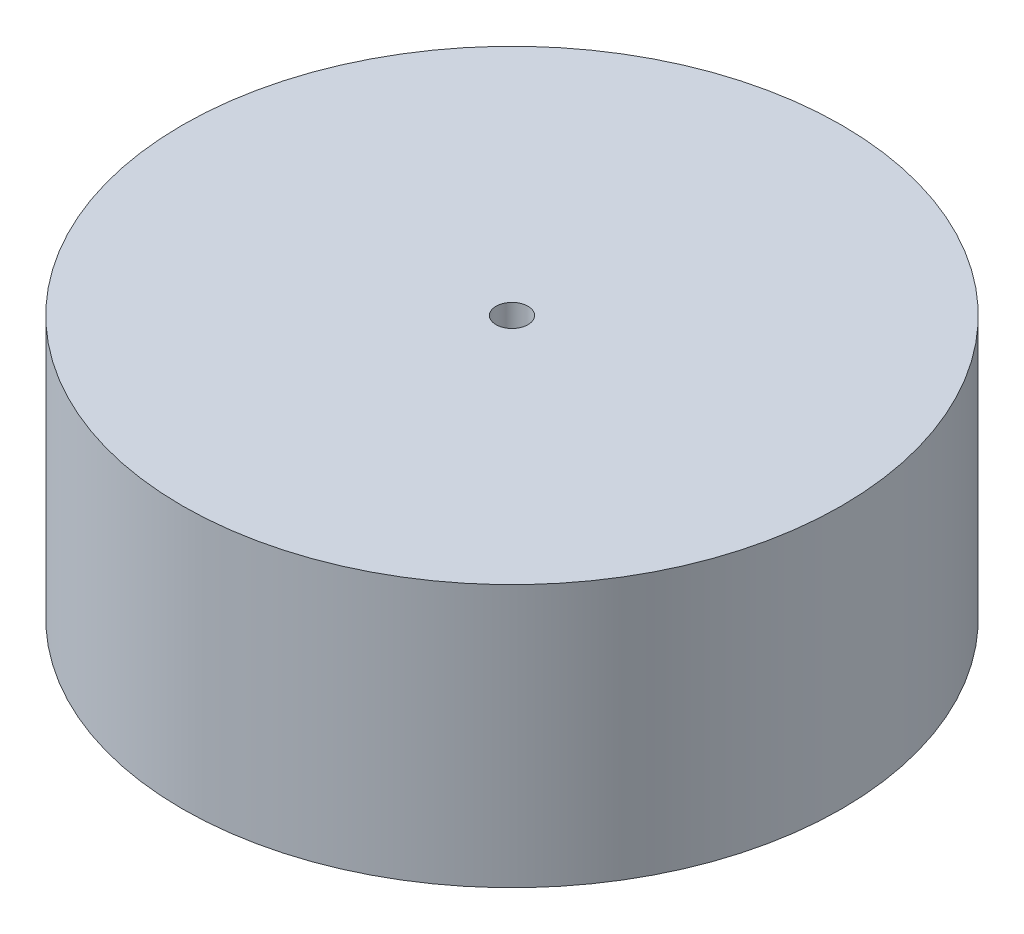
ISO-10303-21;
HEADER;
FILE_DESCRIPTION(('STEP AP214'),'2;1');
FILE_NAME('part.step','',(''),(''),'','','');
FILE_SCHEMA(('AUTOMOTIVE_DESIGN { 1 0 10303 214 1 1 1 1 }'));
ENDSEC;
DATA;
#1=APPLICATION_CONTEXT('core data for automotive mechanical design processes');
#2=APPLICATION_PROTOCOL_DEFINITION('international standard','automotive_design',2000,#1);
#3=PRODUCT_CONTEXT('',#1,'mechanical');
#4=PRODUCT('Part','Part','',(#3));
#5=PRODUCT_RELATED_PRODUCT_CATEGORY('part','',(#4));
#6=PRODUCT_DEFINITION_FORMATION('','',#4);
#7=PRODUCT_DEFINITION_CONTEXT('part definition',#1,'design');
#8=PRODUCT_DEFINITION('design','',#6,#7);
#9=PRODUCT_DEFINITION_SHAPE('','',#8);
#10=(LENGTH_UNIT() NAMED_UNIT(*) SI_UNIT(.MILLI.,.METRE.));
#11=(NAMED_UNIT(*) PLANE_ANGLE_UNIT() SI_UNIT($,.RADIAN.));
#12=(NAMED_UNIT(*) SI_UNIT($,.STERADIAN.) SOLID_ANGLE_UNIT());
#13=UNCERTAINTY_MEASURE_WITH_UNIT(LENGTH_MEASURE(1.E-05),#10,'distance_accuracy_value','');
#14=(GEOMETRIC_REPRESENTATION_CONTEXT(3) GLOBAL_UNCERTAINTY_ASSIGNED_CONTEXT((#13)) GLOBAL_UNIT_ASSIGNED_CONTEXT((#10,
#11,#12)) REPRESENTATION_CONTEXT('',''));
#15=CARTESIAN_POINT('',(0.,0.,0.));
#16=DIRECTION('',(0.,0.,1.));
#17=DIRECTION('',(1.,0.,0.));
#18=AXIS2_PLACEMENT_3D('',#15,#16,#17);
#19=CARTESIAN_POINT('',(0.,41.,0.));
#20=DIRECTION('',(0.,-1.,0.));
#21=DIRECTION('',(0.,0.,-1.));
#22=AXIS2_PLACEMENT_3D('',#19,#20,#21);
#23=CYLINDRICAL_SURFACE('',#22,51.5);
#24=CARTESIAN_POINT('',(0.,41.,0.));
#25=DIRECTION('',(0.,1.,0.));
#26=DIRECTION('',(0.,0.,1.));
#27=AXIS2_PLACEMENT_3D('',#24,#25,#26);
#28=CIRCLE('',#27,51.5);
#29=CARTESIAN_POINT('',(0.,41.,51.5));
#30=VERTEX_POINT('',#29);
#31=EDGE_CURVE('E10',#30,#30,#28,.T.);
#32=ORIENTED_EDGE('',*,*,#31,.F.);
#33=EDGE_LOOP('',(#32));
#34=FACE_BOUND('',#33,.T.);
#35=CARTESIAN_POINT('',(0.,0.,0.));
#36=DIRECTION('',(0.,1.,0.));
#37=DIRECTION('',(0.,0.,1.));
#38=AXIS2_PLACEMENT_3D('',#35,#36,#37);
#39=CIRCLE('',#38,51.5);
#40=CARTESIAN_POINT('',(0.,0.,51.5));
#41=VERTEX_POINT('',#40);
#42=EDGE_CURVE('E45',#41,#41,#39,.T.);
#43=ORIENTED_EDGE('',*,*,#42,.T.);
#44=EDGE_LOOP('',(#43));
#45=FACE_BOUND('',#44,.T.);
#46=ADVANCED_FACE('F39',(#34,#45),#23,.T.);
#47=CARTESIAN_POINT('',(0.,41.,0.));
#48=DIRECTION('',(0.,1.,0.));
#49=DIRECTION('',(0.,0.,1.));
#50=AXIS2_PLACEMENT_3D('',#47,#48,#49);
#51=PLANE('',#50);
#52=CARTESIAN_POINT('',(0.,41.,0.));
#53=DIRECTION('',(0.,1.,0.));
#54=DIRECTION('',(0.,0.,1.));
#55=AXIS2_PLACEMENT_3D('',#52,#53,#54);
#56=CIRCLE('',#55,2.5);
#57=CARTESIAN_POINT('',(0.,41.,2.5));
#58=VERTEX_POINT('',#57);
#59=EDGE_CURVE('E51',#58,#58,#56,.T.);
#60=ORIENTED_EDGE('',*,*,#59,.F.);
#61=EDGE_LOOP('',(#60));
#62=FACE_BOUND('',#61,.T.);
#63=ORIENTED_EDGE('',*,*,#31,.T.);
#64=EDGE_LOOP('',(#63));
#65=FACE_BOUND('',#64,.T.);
#66=ADVANCED_FACE('F68',(#62,#65),#51,.T.);
#67=CARTESIAN_POINT('',(0.,0.,0.));
#68=DIRECTION('',(0.,1.,0.));
#69=DIRECTION('',(0.,0.,1.));
#70=AXIS2_PLACEMENT_3D('',#67,#68,#69);
#71=PLANE('',#70);
#72=CARTESIAN_POINT('',(0.,0.,0.));
#73=DIRECTION('',(0.,1.,0.));
#74=DIRECTION('',(0.,0.,1.));
#75=AXIS2_PLACEMENT_3D('',#72,#73,#74);
#76=CIRCLE('',#75,2.5);
#77=CARTESIAN_POINT('',(0.,0.,2.5));
#78=VERTEX_POINT('',#77);
#79=EDGE_CURVE('E47',#78,#78,#76,.T.);
#80=ORIENTED_EDGE('',*,*,#79,.T.);
#81=EDGE_LOOP('',(#80));
#82=FACE_BOUND('',#81,.T.);
#83=ORIENTED_EDGE('',*,*,#42,.F.);
#84=EDGE_LOOP('',(#83));
#85=FACE_BOUND('',#84,.T.);
#86=ADVANCED_FACE('F60',(#82,#85),#71,.F.);
#87=CARTESIAN_POINT('',(0.,0.,0.));
#88=DIRECTION('',(0.,1.,0.));
#89=DIRECTION('',(0.,0.,1.));
#90=AXIS2_PLACEMENT_3D('',#87,#88,#89);
#91=CYLINDRICAL_SURFACE('',#90,2.5);
#92=ORIENTED_EDGE('',*,*,#79,.F.);
#93=EDGE_LOOP('',(#92));
#94=FACE_BOUND('',#93,.T.);
#95=ORIENTED_EDGE('',*,*,#59,.T.);
#96=EDGE_LOOP('',(#95));
#97=FACE_BOUND('',#96,.T.);
#98=ADVANCED_FACE('F58',(#94,#97),#91,.F.);
#99=CLOSED_SHELL('',(#46,#66,#86,#98));
#100=MANIFOLD_SOLID_BREP('B2',#99);
#101=ADVANCED_BREP_SHAPE_REPRESENTATION('',(#18,#100),#14);
#102=SHAPE_DEFINITION_REPRESENTATION(#9,#101);
ENDSEC;
END-ISO-10303-21;
